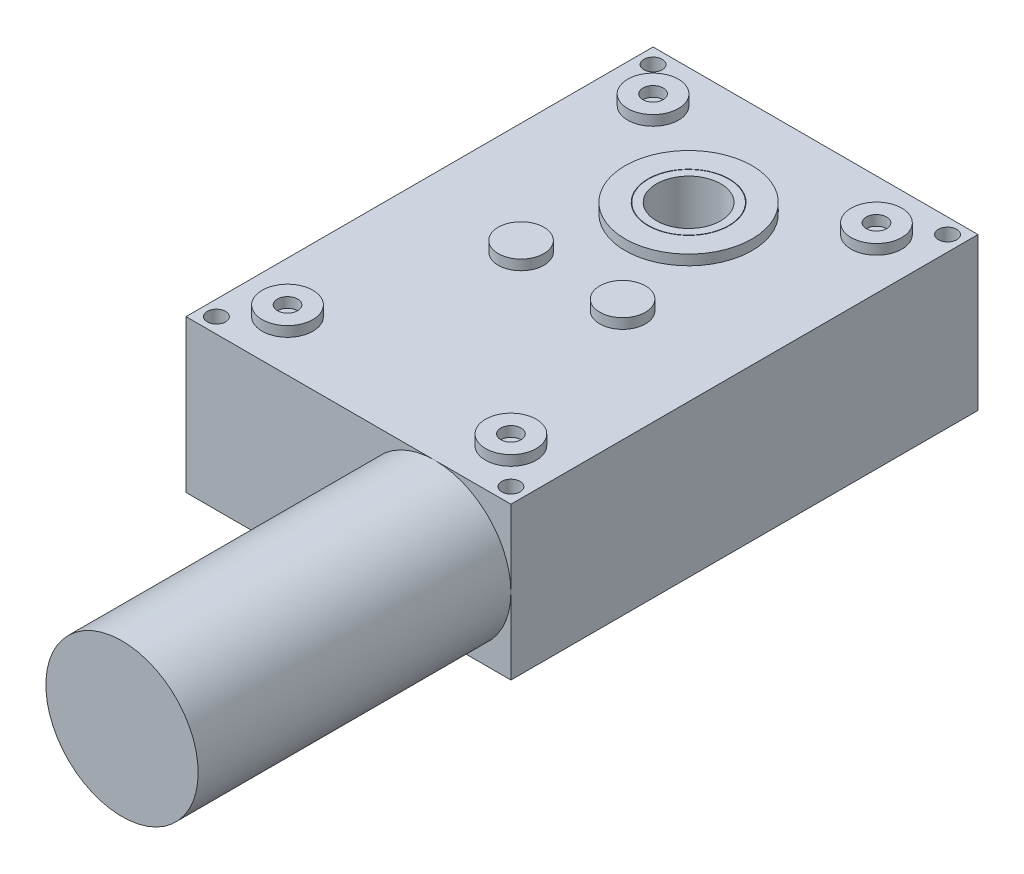
ISO-10303-21;
HEADER;
FILE_DESCRIPTION(('STEP AP214'),'2;1');
FILE_NAME('part.step','',(''),(''),'','','');
FILE_SCHEMA(('AUTOMOTIVE_DESIGN { 1 0 10303 214 1 1 1 1 }'));
ENDSEC;
DATA;
#1=APPLICATION_CONTEXT('core data for automotive mechanical design processes');
#2=APPLICATION_PROTOCOL_DEFINITION('international standard','automotive_design',2000,#1);
#3=PRODUCT_CONTEXT('',#1,'mechanical');
#4=PRODUCT('Part','Part','',(#3));
#5=PRODUCT_RELATED_PRODUCT_CATEGORY('part','',(#4));
#6=PRODUCT_DEFINITION_FORMATION('','',#4);
#7=PRODUCT_DEFINITION_CONTEXT('part definition',#1,'design');
#8=PRODUCT_DEFINITION('design','',#6,#7);
#9=PRODUCT_DEFINITION_SHAPE('','',#8);
#10=(LENGTH_UNIT() NAMED_UNIT(*) SI_UNIT(.MILLI.,.METRE.));
#11=(NAMED_UNIT(*) PLANE_ANGLE_UNIT() SI_UNIT($,.RADIAN.));
#12=(NAMED_UNIT(*) SI_UNIT($,.STERADIAN.) SOLID_ANGLE_UNIT());
#13=UNCERTAINTY_MEASURE_WITH_UNIT(LENGTH_MEASURE(1.E-05),#10,'distance_accuracy_value','');
#14=(GEOMETRIC_REPRESENTATION_CONTEXT(3) GLOBAL_UNCERTAINTY_ASSIGNED_CONTEXT((#13)) GLOBAL_UNIT_ASSIGNED_CONTEXT((#10,
#11,#12)) REPRESENTATION_CONTEXT('',''));
#15=CARTESIAN_POINT('',(0.,0.,0.));
#16=DIRECTION('',(0.,0.,1.));
#17=DIRECTION('',(1.,0.,0.));
#18=AXIS2_PLACEMENT_3D('',#15,#16,#17);
#19=CARTESIAN_POINT('',(-16.,15.,23.));
#20=DIRECTION('',(0.,0.,-1.));
#21=DIRECTION('',(-1.,0.,0.));
#22=AXIS2_PLACEMENT_3D('',#19,#20,#21);
#23=PLANE('',#22);
#24=CARTESIAN_POINT('',(8.5,7.5,23.));
#25=DIRECTION('',(0.,0.,1.));
#26=DIRECTION('',(1.,0.,0.));
#27=AXIS2_PLACEMENT_3D('',#24,#25,#26);
#28=CIRCLE('',#27,7.5);
#29=CARTESIAN_POINT('',(16.,7.5,23.));
#30=VERTEX_POINT('',#29);
#31=CARTESIAN_POINT('',(8.5,15.,23.));
#32=VERTEX_POINT('',#31);
#33=EDGE_CURVE('E198',#30,#32,#28,.T.);
#34=ORIENTED_EDGE('',*,*,#33,.F.);
#35=DIRECTION('',(0.,-1.,0.));
#36=VECTOR('',#35,1.);
#37=CARTESIAN_POINT('',(16.,15.,23.));
#38=LINE('',#37,#36);
#39=CARTESIAN_POINT('',(16.,15.,23.));
#40=VERTEX_POINT('',#39);
#41=EDGE_CURVE('E228',#40,#30,#38,.T.);
#42=ORIENTED_EDGE('',*,*,#41,.F.);
#43=DIRECTION('',(1.,0.,0.));
#44=VECTOR('',#43,1.);
#45=CARTESIAN_POINT('',(-16.,15.,23.));
#46=LINE('',#45,#44);
#47=EDGE_CURVE('E215',#32,#40,#46,.T.);
#48=ORIENTED_EDGE('',*,*,#47,.F.);
#49=EDGE_LOOP('',(#34,#42,#48));
#50=FACE_BOUND('',#49,.T.);
#51=ADVANCED_FACE('F40',(#50),#23,.F.);
#52=CARTESIAN_POINT('',(8.5,0.,23.));
#53=VERTEX_POINT('',#52);
#54=EDGE_CURVE('E55',#32,#53,#28,.T.);
#55=ORIENTED_EDGE('',*,*,#54,.F.);
#56=CARTESIAN_POINT('',(-16.,15.,23.));
#57=VERTEX_POINT('',#56);
#58=EDGE_CURVE('E216',#57,#32,#46,.T.);
#59=ORIENTED_EDGE('',*,*,#58,.F.);
#60=DIRECTION('',(0.,-1.,0.));
#61=VECTOR('',#60,1.);
#62=CARTESIAN_POINT('',(-16.,15.,23.));
#63=LINE('',#62,#61);
#64=CARTESIAN_POINT('',(-16.,0.,23.));
#65=VERTEX_POINT('',#64);
#66=EDGE_CURVE('E230',#57,#65,#63,.T.);
#67=ORIENTED_EDGE('',*,*,#66,.T.);
#68=DIRECTION('',(1.,0.,0.));
#69=VECTOR('',#68,1.);
#70=CARTESIAN_POINT('',(-16.,0.,23.));
#71=LINE('',#70,#69);
#72=EDGE_CURVE('E211',#65,#53,#71,.T.);
#73=ORIENTED_EDGE('',*,*,#72,.T.);
#74=EDGE_LOOP('',(#55,#59,#67,#73));
#75=FACE_BOUND('',#74,.T.);
#76=ADVANCED_FACE('F298',(#75),#23,.F.);
#77=CARTESIAN_POINT('',(16.,15.,23.));
#78=DIRECTION('',(-1.,0.,0.));
#79=DIRECTION('',(0.,0.,1.));
#80=AXIS2_PLACEMENT_3D('',#77,#78,#79);
#81=PLANE('',#80);
#82=DIRECTION('',(0.,0.,-1.));
#83=VECTOR('',#82,1.);
#84=CARTESIAN_POINT('',(16.,0.,23.));
#85=LINE('',#84,#83);
#86=CARTESIAN_POINT('',(16.,0.,23.));
#87=VERTEX_POINT('',#86);
#88=CARTESIAN_POINT('',(16.,0.,-23.));
#89=VERTEX_POINT('',#88);
#90=EDGE_CURVE('E204',#87,#89,#85,.T.);
#91=ORIENTED_EDGE('',*,*,#90,.T.);
#92=DIRECTION('',(0.,-1.,0.));
#93=VECTOR('',#92,1.);
#94=CARTESIAN_POINT('',(16.,15.,-23.));
#95=LINE('',#94,#93);
#96=CARTESIAN_POINT('',(16.,15.,-23.));
#97=VERTEX_POINT('',#96);
#98=EDGE_CURVE('E236',#97,#89,#95,.T.);
#99=ORIENTED_EDGE('',*,*,#98,.F.);
#100=DIRECTION('',(0.,0.,-1.));
#101=VECTOR('',#100,1.);
#102=CARTESIAN_POINT('',(16.,15.,23.));
#103=LINE('',#102,#101);
#104=EDGE_CURVE('E207',#40,#97,#103,.T.);
#105=ORIENTED_EDGE('',*,*,#104,.F.);
#106=ORIENTED_EDGE('',*,*,#41,.T.);
#107=EDGE_CURVE('E219',#30,#87,#38,.T.);
#108=ORIENTED_EDGE('',*,*,#107,.T.);
#109=EDGE_LOOP('',(#91,#99,#105,#106,#108));
#110=FACE_BOUND('',#109,.T.);
#111=ADVANCED_FACE('F42',(#110),#81,.F.);
#112=CARTESIAN_POINT('',(-16.,15.,-23.));
#113=DIRECTION('',(0.,0.,1.));
#114=DIRECTION('',(1.,0.,0.));
#115=AXIS2_PLACEMENT_3D('',#112,#113,#114);
#116=PLANE('',#115);
#117=DIRECTION('',(-1.,0.,0.));
#118=VECTOR('',#117,1.);
#119=CARTESIAN_POINT('',(-16.,0.,-23.));
#120=LINE('',#119,#118);
#121=CARTESIAN_POINT('',(-16.,0.,-23.));
#122=VERTEX_POINT('',#121);
#123=EDGE_CURVE('E222',#89,#122,#120,.T.);
#124=ORIENTED_EDGE('',*,*,#123,.T.);
#125=DIRECTION('',(0.,-1.,0.));
#126=VECTOR('',#125,1.);
#127=CARTESIAN_POINT('',(-16.,15.,-23.));
#128=LINE('',#127,#126);
#129=CARTESIAN_POINT('',(-16.,15.,-23.));
#130=VERTEX_POINT('',#129);
#131=EDGE_CURVE('E233',#130,#122,#128,.T.);
#132=ORIENTED_EDGE('',*,*,#131,.F.);
#133=DIRECTION('',(-1.,0.,0.));
#134=VECTOR('',#133,1.);
#135=CARTESIAN_POINT('',(-16.,15.,-23.));
#136=LINE('',#135,#134);
#137=EDGE_CURVE('E210',#97,#130,#136,.T.);
#138=ORIENTED_EDGE('',*,*,#137,.F.);
#139=ORIENTED_EDGE('',*,*,#98,.T.);
#140=EDGE_LOOP('',(#124,#132,#138,#139));
#141=FACE_BOUND('',#140,.T.);
#142=ADVANCED_FACE('F286',(#141),#116,.F.);
#143=CARTESIAN_POINT('',(-16.,15.,23.));
#144=DIRECTION('',(1.,0.,0.));
#145=DIRECTION('',(0.,0.,-1.));
#146=AXIS2_PLACEMENT_3D('',#143,#144,#145);
#147=PLANE('',#146);
#148=DIRECTION('',(0.,0.,1.));
#149=VECTOR('',#148,1.);
#150=CARTESIAN_POINT('',(-16.,0.,23.));
#151=LINE('',#150,#149);
#152=EDGE_CURVE('E224',#122,#65,#151,.T.);
#153=ORIENTED_EDGE('',*,*,#152,.T.);
#154=ORIENTED_EDGE('',*,*,#66,.F.);
#155=DIRECTION('',(0.,0.,1.));
#156=VECTOR('',#155,1.);
#157=CARTESIAN_POINT('',(-16.,15.,23.));
#158=LINE('',#157,#156);
#159=EDGE_CURVE('E213',#130,#57,#158,.T.);
#160=ORIENTED_EDGE('',*,*,#159,.F.);
#161=ORIENTED_EDGE('',*,*,#131,.T.);
#162=EDGE_LOOP('',(#153,#154,#160,#161));
#163=FACE_BOUND('',#162,.T.);
#164=ADVANCED_FACE('F291',(#163),#147,.F.);
#165=EDGE_CURVE('E63',#53,#30,#28,.T.);
#166=ORIENTED_EDGE('',*,*,#165,.F.);
#167=EDGE_CURVE('E226',#53,#87,#71,.T.);
#168=ORIENTED_EDGE('',*,*,#167,.T.);
#169=ORIENTED_EDGE('',*,*,#107,.F.);
#170=EDGE_LOOP('',(#166,#168,#169));
#171=FACE_BOUND('',#170,.T.);
#172=ADVANCED_FACE('F262',(#171),#23,.F.);
#173=CARTESIAN_POINT('',(0.,15.,0.));
#174=DIRECTION('',(0.,-1.,0.));
#175=DIRECTION('',(0.,0.,-1.));
#176=AXIS2_PLACEMENT_3D('',#173,#174,#175);
#177=PLANE('',#176);
#178=CARTESIAN_POINT('',(-14.5,15.,-21.5));
#179=DIRECTION('',(0.,1.,0.));
#180=DIRECTION('',(0.,0.,1.));
#181=AXIS2_PLACEMENT_3D('',#178,#179,#180);
#182=CIRCLE('',#181,0.899999999999989);
#183=CARTESIAN_POINT('',(-14.5,15.,-20.6));
#184=VERTEX_POINT('',#183);
#185=EDGE_CURVE('E115',#184,#184,#182,.T.);
#186=ORIENTED_EDGE('',*,*,#185,.F.);
#187=EDGE_LOOP('',(#186));
#188=FACE_BOUND('',#187,.T.);
#189=CARTESIAN_POINT('',(14.5,15.,-21.5));
#190=DIRECTION('',(0.,1.,0.));
#191=DIRECTION('',(0.,0.,1.));
#192=AXIS2_PLACEMENT_3D('',#189,#190,#191);
#193=CIRCLE('',#192,0.899999999999989);
#194=CARTESIAN_POINT('',(14.5,15.,-20.6));
#195=VERTEX_POINT('',#194);
#196=EDGE_CURVE('E114',#195,#195,#193,.T.);
#197=ORIENTED_EDGE('',*,*,#196,.F.);
#198=EDGE_LOOP('',(#197));
#199=FACE_BOUND('',#198,.T.);
#200=CARTESIAN_POINT('',(-14.5,15.,21.5));
#201=DIRECTION('',(0.,1.,0.));
#202=DIRECTION('',(0.,0.,1.));
#203=AXIS2_PLACEMENT_3D('',#200,#201,#202);
#204=CIRCLE('',#203,0.899999999999989);
#205=CARTESIAN_POINT('',(-14.5,15.,22.4));
#206=VERTEX_POINT('',#205);
#207=EDGE_CURVE('E125',#206,#206,#204,.T.);
#208=ORIENTED_EDGE('',*,*,#207,.F.);
#209=EDGE_LOOP('',(#208));
#210=FACE_BOUND('',#209,.T.);
#211=CARTESIAN_POINT('',(14.5,15.,21.5));
#212=DIRECTION('',(0.,1.,0.));
#213=DIRECTION('',(0.,0.,1.));
#214=AXIS2_PLACEMENT_3D('',#211,#212,#213);
#215=CIRCLE('',#214,0.899999999999989);
#216=CARTESIAN_POINT('',(14.5,15.,22.4));
#217=VERTEX_POINT('',#216);
#218=EDGE_CURVE('E131',#217,#217,#215,.T.);
#219=ORIENTED_EDGE('',*,*,#218,.F.);
#220=EDGE_LOOP('',(#219));
#221=FACE_BOUND('',#220,.T.);
#222=CARTESIAN_POINT('',(0.,15.,-10.5));
#223=DIRECTION('',(0.,-1.,0.));
#224=DIRECTION('',(0.,0.,-1.));
#225=AXIS2_PLACEMENT_3D('',#222,#223,#224);
#226=CIRCLE('',#225,6.25);
#227=CARTESIAN_POINT('',(0.,15.,-16.75));
#228=VERTEX_POINT('',#227);
#229=EDGE_CURVE('E48',#228,#228,#226,.F.);
#230=ORIENTED_EDGE('',*,*,#229,.F.);
#231=EDGE_LOOP('',(#230));
#232=FACE_BOUND('',#231,.T.);
#233=CARTESIAN_POINT('',(11.,15.,18.));
#234=DIRECTION('',(0.,-1.,0.));
#235=DIRECTION('',(0.,0.,-1.));
#236=AXIS2_PLACEMENT_3D('',#233,#234,#235);
#237=CIRCLE('',#236,2.5);
#238=CARTESIAN_POINT('',(11.,15.,15.5));
#239=VERTEX_POINT('',#238);
#240=EDGE_CURVE('E251',#239,#239,#237,.F.);
#241=ORIENTED_EDGE('',*,*,#240,.F.);
#242=EDGE_LOOP('',(#241));
#243=FACE_BOUND('',#242,.T.);
#244=CARTESIAN_POINT('',(-11.,15.,18.));
#245=DIRECTION('',(0.,1.,0.));
#246=DIRECTION('',(0.,0.,1.));
#247=AXIS2_PLACEMENT_3D('',#244,#245,#246);
#248=CIRCLE('',#247,2.5);
#249=CARTESIAN_POINT('',(-11.,15.,20.5));
#250=VERTEX_POINT('',#249);
#251=EDGE_CURVE('E162',#250,#250,#248,.F.);
#252=ORIENTED_EDGE('',*,*,#251,.T.);
#253=EDGE_LOOP('',(#252));
#254=FACE_BOUND('',#253,.T.);
#255=CARTESIAN_POINT('',(5.,15.,1.));
#256=DIRECTION('',(0.,1.,0.));
#257=DIRECTION('',(0.,0.,1.));
#258=AXIS2_PLACEMENT_3D('',#255,#256,#257);
#259=CIRCLE('',#258,2.25);
#260=CARTESIAN_POINT('',(5.,15.,3.25));
#261=VERTEX_POINT('',#260);
#262=EDGE_CURVE('E171',#261,#261,#259,.F.);
#263=ORIENTED_EDGE('',*,*,#262,.T.);
#264=EDGE_LOOP('',(#263));
#265=FACE_BOUND('',#264,.T.);
#266=CARTESIAN_POINT('',(-5.,15.,1.));
#267=DIRECTION('',(0.,-1.,0.));
#268=DIRECTION('',(0.,0.,-1.));
#269=AXIS2_PLACEMENT_3D('',#266,#267,#268);
#270=CIRCLE('',#269,2.25);
#271=CARTESIAN_POINT('',(-5.,15.,-1.25));
#272=VERTEX_POINT('',#271);
#273=EDGE_CURVE('E245',#272,#272,#270,.F.);
#274=ORIENTED_EDGE('',*,*,#273,.F.);
#275=EDGE_LOOP('',(#274));
#276=FACE_BOUND('',#275,.T.);
#277=CARTESIAN_POINT('',(11.,15.,-18.));
#278=DIRECTION('',(0.,1.,0.));
#279=DIRECTION('',(0.,0.,1.));
#280=AXIS2_PLACEMENT_3D('',#277,#278,#279);
#281=CIRCLE('',#280,2.5);
#282=CARTESIAN_POINT('',(11.,15.,-15.5));
#283=VERTEX_POINT('',#282);
#284=EDGE_CURVE('E182',#283,#283,#281,.F.);
#285=ORIENTED_EDGE('',*,*,#284,.T.);
#286=EDGE_LOOP('',(#285));
#287=FACE_BOUND('',#286,.T.);
#288=CARTESIAN_POINT('',(-11.,15.,-18.));
#289=DIRECTION('',(0.,-1.,0.));
#290=DIRECTION('',(0.,0.,-1.));
#291=AXIS2_PLACEMENT_3D('',#288,#289,#290);
#292=CIRCLE('',#291,2.5);
#293=CARTESIAN_POINT('',(-11.,15.,-20.5));
#294=VERTEX_POINT('',#293);
#295=EDGE_CURVE('E239',#294,#294,#292,.F.);
#296=ORIENTED_EDGE('',*,*,#295,.F.);
#297=EDGE_LOOP('',(#296));
#298=FACE_BOUND('',#297,.T.);
#299=ORIENTED_EDGE('',*,*,#104,.T.);
#300=ORIENTED_EDGE('',*,*,#137,.T.);
#301=ORIENTED_EDGE('',*,*,#159,.T.);
#302=ORIENTED_EDGE('',*,*,#58,.T.);
#303=ORIENTED_EDGE('',*,*,#47,.T.);
#304=EDGE_LOOP('',(#299,#300,#301,#302,#303));
#305=FACE_BOUND('',#304,.T.);
#306=ADVANCED_FACE('F258',(#188,#199,#210,#221,#232,#243,#254,#265,#276,#287,#298,#305),#177,.F.);
#307=CARTESIAN_POINT('',(0.,0.,0.));
#308=DIRECTION('',(0.,-1.,0.));
#309=DIRECTION('',(0.,0.,-1.));
#310=AXIS2_PLACEMENT_3D('',#307,#308,#309);
#311=PLANE('',#310);
#312=ORIENTED_EDGE('',*,*,#90,.F.);
#313=ORIENTED_EDGE('',*,*,#167,.F.);
#314=ORIENTED_EDGE('',*,*,#72,.F.);
#315=ORIENTED_EDGE('',*,*,#152,.F.);
#316=ORIENTED_EDGE('',*,*,#123,.F.);
#317=EDGE_LOOP('',(#312,#313,#314,#315,#316));
#318=FACE_BOUND('',#317,.T.);
#319=ADVANCED_FACE('F261',(#318),#311,.T.);
#320=CARTESIAN_POINT('',(8.5,7.5,53.8));
#321=DIRECTION('',(0.,0.,-1.));
#322=DIRECTION('',(-1.,0.,0.));
#323=AXIS2_PLACEMENT_3D('',#320,#321,#322);
#324=CYLINDRICAL_SURFACE('',#323,7.5);
#325=CARTESIAN_POINT('',(8.5,7.5,53.8));
#326=DIRECTION('',(0.,0.,1.));
#327=DIRECTION('',(1.,0.,0.));
#328=AXIS2_PLACEMENT_3D('',#325,#326,#327);
#329=CIRCLE('',#328,7.5);
#330=CARTESIAN_POINT('',(16.,7.5,53.8));
#331=VERTEX_POINT('',#330);
#332=EDGE_CURVE('E201',#331,#331,#329,.T.);
#333=ORIENTED_EDGE('',*,*,#332,.F.);
#334=EDGE_LOOP('',(#333));
#335=FACE_BOUND('',#334,.T.);
#336=ORIENTED_EDGE('',*,*,#33,.T.);
#337=ORIENTED_EDGE('',*,*,#54,.T.);
#338=ORIENTED_EDGE('',*,*,#165,.T.);
#339=EDGE_LOOP('',(#336,#337,#338));
#340=FACE_BOUND('',#339,.T.);
#341=ADVANCED_FACE('F294',(#335,#340),#324,.T.);
#342=CARTESIAN_POINT('',(8.5,7.5,53.8));
#343=DIRECTION('',(0.,0.,1.));
#344=DIRECTION('',(1.,0.,0.));
#345=AXIS2_PLACEMENT_3D('',#342,#343,#344);
#346=PLANE('',#345);
#347=ORIENTED_EDGE('',*,*,#332,.T.);
#348=EDGE_LOOP('',(#347));
#349=FACE_BOUND('',#348,.T.);
#350=ADVANCED_FACE('F345',(#349),#346,.T.);
#351=CARTESIAN_POINT('',(-11.,16.,-18.));
#352=DIRECTION('',(0.,-1.,0.));
#353=DIRECTION('',(0.,0.,-1.));
#354=AXIS2_PLACEMENT_3D('',#351,#352,#353);
#355=CYLINDRICAL_SURFACE('',#354,1.);
#356=CARTESIAN_POINT('',(-11.,16.,-18.));
#357=DIRECTION('',(0.,1.,0.));
#358=DIRECTION('',(0.,0.,1.));
#359=AXIS2_PLACEMENT_3D('',#356,#357,#358);
#360=CIRCLE('',#359,1.);
#361=CARTESIAN_POINT('',(-11.,16.,-17.));
#362=VERTEX_POINT('',#361);
#363=EDGE_CURVE('E192',#362,#362,#360,.T.);
#364=ORIENTED_EDGE('',*,*,#363,.T.);
#365=EDGE_LOOP('',(#364));
#366=FACE_BOUND('',#365,.T.);
#367=CARTESIAN_POINT('',(-11.,15.,-18.));
#368=DIRECTION('',(0.,1.,0.));
#369=DIRECTION('',(0.,0.,1.));
#370=AXIS2_PLACEMENT_3D('',#367,#368,#369);
#371=CIRCLE('',#370,1.);
#372=CARTESIAN_POINT('',(-11.,15.,-17.));
#373=VERTEX_POINT('',#372);
#374=EDGE_CURVE('E189',#373,#373,#371,.T.);
#375=ORIENTED_EDGE('',*,*,#374,.F.);
#376=EDGE_LOOP('',(#375));
#377=FACE_BOUND('',#376,.T.);
#378=ADVANCED_FACE('F356',(#366,#377),#355,.F.);
#379=CARTESIAN_POINT('',(-11.,16.,-18.));
#380=DIRECTION('',(0.,-1.,0.));
#381=DIRECTION('',(0.,0.,-1.));
#382=AXIS2_PLACEMENT_3D('',#379,#380,#381);
#383=CYLINDRICAL_SURFACE('',#382,2.5);
#384=CARTESIAN_POINT('',(-11.,16.,-18.));
#385=DIRECTION('',(0.,1.,0.));
#386=DIRECTION('',(0.,0.,1.));
#387=AXIS2_PLACEMENT_3D('',#384,#385,#386);
#388=CIRCLE('',#387,2.5);
#389=CARTESIAN_POINT('',(-11.,16.,-15.5));
#390=VERTEX_POINT('',#389);
#391=EDGE_CURVE('E195',#390,#390,#388,.T.);
#392=ORIENTED_EDGE('',*,*,#391,.F.);
#393=EDGE_LOOP('',(#392));
#394=FACE_BOUND('',#393,.T.);
#395=ORIENTED_EDGE('',*,*,#295,.T.);
#396=EDGE_LOOP('',(#395));
#397=FACE_BOUND('',#396,.T.);
#398=ADVANCED_FACE('F367',(#394,#397),#383,.T.);
#399=CARTESIAN_POINT('',(0.,16.,0.));
#400=DIRECTION('',(0.,1.,0.));
#401=DIRECTION('',(0.,0.,1.));
#402=AXIS2_PLACEMENT_3D('',#399,#400,#401);
#403=PLANE('',#402);
#404=ORIENTED_EDGE('',*,*,#363,.F.);
#405=EDGE_LOOP('',(#404));
#406=FACE_BOUND('',#405,.T.);
#407=ORIENTED_EDGE('',*,*,#391,.T.);
#408=EDGE_LOOP('',(#407));
#409=FACE_BOUND('',#408,.T.);
#410=ADVANCED_FACE('F378',(#406,#409),#403,.T.);
#411=ORIENTED_EDGE('',*,*,#374,.T.);
#412=EDGE_LOOP('',(#411));
#413=FACE_BOUND('',#412,.T.);
#414=ADVANCED_FACE('F266',(#413),#177,.F.);
#415=CARTESIAN_POINT('',(11.,16.,-18.));
#416=DIRECTION('',(0.,-1.,0.));
#417=DIRECTION('',(0.,0.,-1.));
#418=AXIS2_PLACEMENT_3D('',#415,#416,#417);
#419=CYLINDRICAL_SURFACE('',#418,2.5);
#420=CARTESIAN_POINT('',(11.,16.,-18.));
#421=DIRECTION('',(0.,1.,0.));
#422=DIRECTION('',(0.,0.,1.));
#423=AXIS2_PLACEMENT_3D('',#420,#421,#422);
#424=CIRCLE('',#423,2.5);
#425=CARTESIAN_POINT('',(11.,16.,-15.5));
#426=VERTEX_POINT('',#425);
#427=EDGE_CURVE('E183',#426,#426,#424,.F.);
#428=ORIENTED_EDGE('',*,*,#427,.T.);
#429=EDGE_LOOP('',(#428));
#430=FACE_BOUND('',#429,.T.);
#431=ORIENTED_EDGE('',*,*,#284,.F.);
#432=EDGE_LOOP('',(#431));
#433=FACE_BOUND('',#432,.T.);
#434=ADVANCED_FACE('F397',(#430,#433),#419,.T.);
#435=CARTESIAN_POINT('',(11.,16.,-18.));
#436=DIRECTION('',(0.,-1.,0.));
#437=DIRECTION('',(0.,0.,-1.));
#438=AXIS2_PLACEMENT_3D('',#435,#436,#437);
#439=CYLINDRICAL_SURFACE('',#438,1.);
#440=CARTESIAN_POINT('',(11.,16.,-18.));
#441=DIRECTION('',(0.,1.,0.));
#442=DIRECTION('',(0.,0.,1.));
#443=AXIS2_PLACEMENT_3D('',#440,#441,#442);
#444=CIRCLE('',#443,1.);
#445=CARTESIAN_POINT('',(11.,16.,-17.));
#446=VERTEX_POINT('',#445);
#447=EDGE_CURVE('E186',#446,#446,#444,.F.);
#448=ORIENTED_EDGE('',*,*,#447,.F.);
#449=EDGE_LOOP('',(#448));
#450=FACE_BOUND('',#449,.T.);
#451=CARTESIAN_POINT('',(11.,15.,-18.));
#452=DIRECTION('',(0.,-1.,0.));
#453=DIRECTION('',(0.,0.,-1.));
#454=AXIS2_PLACEMENT_3D('',#451,#452,#453);
#455=CIRCLE('',#454,1.);
#456=CARTESIAN_POINT('',(11.,15.,-19.));
#457=VERTEX_POINT('',#456);
#458=EDGE_CURVE('E242',#457,#457,#455,.T.);
#459=ORIENTED_EDGE('',*,*,#458,.T.);
#460=EDGE_LOOP('',(#459));
#461=FACE_BOUND('',#460,.T.);
#462=ADVANCED_FACE('F407',(#450,#461),#439,.F.);
#463=CARTESIAN_POINT('',(0.,16.,0.));
#464=DIRECTION('',(0.,1.,0.));
#465=DIRECTION('',(0.,0.,1.));
#466=AXIS2_PLACEMENT_3D('',#463,#464,#465);
#467=PLANE('',#466);
#468=ORIENTED_EDGE('',*,*,#427,.F.);
#469=EDGE_LOOP('',(#468));
#470=FACE_BOUND('',#469,.T.);
#471=ORIENTED_EDGE('',*,*,#447,.T.);
#472=EDGE_LOOP('',(#471));
#473=FACE_BOUND('',#472,.T.);
#474=ADVANCED_FACE('F417',(#470,#473),#467,.T.);
#475=ORIENTED_EDGE('',*,*,#458,.F.);
#476=EDGE_LOOP('',(#475));
#477=FACE_BOUND('',#476,.T.);
#478=ADVANCED_FACE('F399',(#477),#177,.F.);
#479=CARTESIAN_POINT('',(-5.,16.,1.));
#480=DIRECTION('',(0.,-1.,0.));
#481=DIRECTION('',(0.,0.,-1.));
#482=AXIS2_PLACEMENT_3D('',#479,#480,#481);
#483=CYLINDRICAL_SURFACE('',#482,2.25);
#484=CARTESIAN_POINT('',(-5.,16.,1.));
#485=DIRECTION('',(0.,1.,0.));
#486=DIRECTION('',(0.,0.,1.));
#487=AXIS2_PLACEMENT_3D('',#484,#485,#486);
#488=CIRCLE('',#487,2.25);
#489=CARTESIAN_POINT('',(-5.,16.,3.25));
#490=VERTEX_POINT('',#489);
#491=EDGE_CURVE('E177',#490,#490,#488,.T.);
#492=ORIENTED_EDGE('',*,*,#491,.F.);
#493=EDGE_LOOP('',(#492));
#494=FACE_BOUND('',#493,.T.);
#495=ORIENTED_EDGE('',*,*,#273,.T.);
#496=EDGE_LOOP('',(#495));
#497=FACE_BOUND('',#496,.T.);
#498=ADVANCED_FACE('F436',(#494,#497),#483,.T.);
#499=CARTESIAN_POINT('',(0.,16.,0.));
#500=DIRECTION('',(0.,1.,0.));
#501=DIRECTION('',(0.,0.,1.));
#502=AXIS2_PLACEMENT_3D('',#499,#500,#501);
#503=PLANE('',#502);
#504=ORIENTED_EDGE('',*,*,#491,.T.);
#505=EDGE_LOOP('',(#504));
#506=FACE_BOUND('',#505,.T.);
#507=ADVANCED_FACE('F446',(#506),#503,.T.);
#508=CARTESIAN_POINT('',(5.,16.,1.));
#509=DIRECTION('',(0.,-1.,0.));
#510=DIRECTION('',(0.,0.,-1.));
#511=AXIS2_PLACEMENT_3D('',#508,#509,#510);
#512=CYLINDRICAL_SURFACE('',#511,2.25);
#513=CARTESIAN_POINT('',(5.,16.,1.));
#514=DIRECTION('',(0.,1.,0.));
#515=DIRECTION('',(0.,0.,1.));
#516=AXIS2_PLACEMENT_3D('',#513,#514,#515);
#517=CIRCLE('',#516,2.25);
#518=CARTESIAN_POINT('',(5.,16.,3.25));
#519=VERTEX_POINT('',#518);
#520=EDGE_CURVE('E174',#519,#519,#517,.F.);
#521=ORIENTED_EDGE('',*,*,#520,.T.);
#522=EDGE_LOOP('',(#521));
#523=FACE_BOUND('',#522,.T.);
#524=ORIENTED_EDGE('',*,*,#262,.F.);
#525=EDGE_LOOP('',(#524));
#526=FACE_BOUND('',#525,.T.);
#527=ADVANCED_FACE('F456',(#523,#526),#512,.T.);
#528=CARTESIAN_POINT('',(0.,16.,0.));
#529=DIRECTION('',(0.,1.,0.));
#530=DIRECTION('',(0.,0.,1.));
#531=AXIS2_PLACEMENT_3D('',#528,#529,#530);
#532=PLANE('',#531);
#533=ORIENTED_EDGE('',*,*,#520,.F.);
#534=EDGE_LOOP('',(#533));
#535=FACE_BOUND('',#534,.T.);
#536=ADVANCED_FACE('F466',(#535),#532,.T.);
#537=CARTESIAN_POINT('',(-11.,16.,18.));
#538=DIRECTION('',(0.,-1.,0.));
#539=DIRECTION('',(0.,0.,-1.));
#540=AXIS2_PLACEMENT_3D('',#537,#538,#539);
#541=CYLINDRICAL_SURFACE('',#540,2.5);
#542=CARTESIAN_POINT('',(-11.,16.,18.));
#543=DIRECTION('',(0.,1.,0.));
#544=DIRECTION('',(0.,0.,1.));
#545=AXIS2_PLACEMENT_3D('',#542,#543,#544);
#546=CIRCLE('',#545,2.5);
#547=CARTESIAN_POINT('',(-11.,16.,20.5));
#548=VERTEX_POINT('',#547);
#549=EDGE_CURVE('E165',#548,#548,#546,.F.);
#550=ORIENTED_EDGE('',*,*,#549,.T.);
#551=EDGE_LOOP('',(#550));
#552=FACE_BOUND('',#551,.T.);
#553=ORIENTED_EDGE('',*,*,#251,.F.);
#554=EDGE_LOOP('',(#553));
#555=FACE_BOUND('',#554,.T.);
#556=ADVANCED_FACE('F476',(#552,#555),#541,.T.);
#557=CARTESIAN_POINT('',(-11.,16.,18.));
#558=DIRECTION('',(0.,-1.,0.));
#559=DIRECTION('',(0.,0.,-1.));
#560=AXIS2_PLACEMENT_3D('',#557,#558,#559);
#561=CYLINDRICAL_SURFACE('',#560,1.);
#562=CARTESIAN_POINT('',(-11.,16.,18.));
#563=DIRECTION('',(0.,1.,0.));
#564=DIRECTION('',(0.,0.,1.));
#565=AXIS2_PLACEMENT_3D('',#562,#563,#564);
#566=CIRCLE('',#565,1.);
#567=CARTESIAN_POINT('',(-11.,16.,19.));
#568=VERTEX_POINT('',#567);
#569=EDGE_CURVE('E168',#568,#568,#566,.F.);
#570=ORIENTED_EDGE('',*,*,#569,.F.);
#571=EDGE_LOOP('',(#570));
#572=FACE_BOUND('',#571,.T.);
#573=CARTESIAN_POINT('',(-11.,15.,18.));
#574=DIRECTION('',(0.,-1.,0.));
#575=DIRECTION('',(0.,0.,-1.));
#576=AXIS2_PLACEMENT_3D('',#573,#574,#575);
#577=CIRCLE('',#576,1.);
#578=CARTESIAN_POINT('',(-11.,15.,17.));
#579=VERTEX_POINT('',#578);
#580=EDGE_CURVE('E248',#579,#579,#577,.T.);
#581=ORIENTED_EDGE('',*,*,#580,.T.);
#582=EDGE_LOOP('',(#581));
#583=FACE_BOUND('',#582,.T.);
#584=ADVANCED_FACE('F486',(#572,#583),#561,.F.);
#585=CARTESIAN_POINT('',(0.,16.,0.));
#586=DIRECTION('',(0.,1.,0.));
#587=DIRECTION('',(0.,0.,1.));
#588=AXIS2_PLACEMENT_3D('',#585,#586,#587);
#589=PLANE('',#588);
#590=ORIENTED_EDGE('',*,*,#549,.F.);
#591=EDGE_LOOP('',(#590));
#592=FACE_BOUND('',#591,.T.);
#593=ORIENTED_EDGE('',*,*,#569,.T.);
#594=EDGE_LOOP('',(#593));
#595=FACE_BOUND('',#594,.T.);
#596=ADVANCED_FACE('F496',(#592,#595),#589,.T.);
#597=ORIENTED_EDGE('',*,*,#580,.F.);
#598=EDGE_LOOP('',(#597));
#599=FACE_BOUND('',#598,.T.);
#600=ADVANCED_FACE('F438',(#599),#177,.F.);
#601=CARTESIAN_POINT('',(11.,16.,18.));
#602=DIRECTION('',(0.,-1.,0.));
#603=DIRECTION('',(0.,0.,-1.));
#604=AXIS2_PLACEMENT_3D('',#601,#602,#603);
#605=CYLINDRICAL_SURFACE('',#604,1.);
#606=CARTESIAN_POINT('',(11.,16.,18.));
#607=DIRECTION('',(0.,1.,0.));
#608=DIRECTION('',(0.,0.,1.));
#609=AXIS2_PLACEMENT_3D('',#606,#607,#608);
#610=CIRCLE('',#609,1.);
#611=CARTESIAN_POINT('',(11.,16.,19.));
#612=VERTEX_POINT('',#611);
#613=EDGE_CURVE('E156',#612,#612,#610,.T.);
#614=ORIENTED_EDGE('',*,*,#613,.T.);
#615=EDGE_LOOP('',(#614));
#616=FACE_BOUND('',#615,.T.);
#617=CARTESIAN_POINT('',(11.,15.,18.));
#618=DIRECTION('',(0.,1.,0.));
#619=DIRECTION('',(0.,0.,1.));
#620=AXIS2_PLACEMENT_3D('',#617,#618,#619);
#621=CIRCLE('',#620,1.);
#622=CARTESIAN_POINT('',(11.,15.,19.));
#623=VERTEX_POINT('',#622);
#624=EDGE_CURVE('E153',#623,#623,#621,.T.);
#625=ORIENTED_EDGE('',*,*,#624,.F.);
#626=EDGE_LOOP('',(#625));
#627=FACE_BOUND('',#626,.T.);
#628=ADVANCED_FACE('F515',(#616,#627),#605,.F.);
#629=CARTESIAN_POINT('',(11.,16.,18.));
#630=DIRECTION('',(0.,-1.,0.));
#631=DIRECTION('',(0.,0.,-1.));
#632=AXIS2_PLACEMENT_3D('',#629,#630,#631);
#633=CYLINDRICAL_SURFACE('',#632,2.5);
#634=CARTESIAN_POINT('',(11.,16.,18.));
#635=DIRECTION('',(0.,1.,0.));
#636=DIRECTION('',(0.,0.,1.));
#637=AXIS2_PLACEMENT_3D('',#634,#635,#636);
#638=CIRCLE('',#637,2.5);
#639=CARTESIAN_POINT('',(11.,16.,20.5));
#640=VERTEX_POINT('',#639);
#641=EDGE_CURVE('E159',#640,#640,#638,.T.);
#642=ORIENTED_EDGE('',*,*,#641,.F.);
#643=EDGE_LOOP('',(#642));
#644=FACE_BOUND('',#643,.T.);
#645=ORIENTED_EDGE('',*,*,#240,.T.);
#646=EDGE_LOOP('',(#645));
#647=FACE_BOUND('',#646,.T.);
#648=ADVANCED_FACE('F525',(#644,#647),#633,.T.);
#649=CARTESIAN_POINT('',(0.,16.,0.));
#650=DIRECTION('',(0.,1.,0.));
#651=DIRECTION('',(0.,0.,1.));
#652=AXIS2_PLACEMENT_3D('',#649,#650,#651);
#653=PLANE('',#652);
#654=ORIENTED_EDGE('',*,*,#613,.F.);
#655=EDGE_LOOP('',(#654));
#656=FACE_BOUND('',#655,.T.);
#657=ORIENTED_EDGE('',*,*,#641,.T.);
#658=EDGE_LOOP('',(#657));
#659=FACE_BOUND('',#658,.T.);
#660=ADVANCED_FACE('F535',(#656,#659),#653,.T.);
#661=ORIENTED_EDGE('',*,*,#624,.T.);
#662=EDGE_LOOP('',(#661));
#663=FACE_BOUND('',#662,.T.);
#664=ADVANCED_FACE('F517',(#663),#177,.F.);
#665=CARTESIAN_POINT('',(0.,16.,-10.5));
#666=DIRECTION('',(0.,-1.,0.));
#667=DIRECTION('',(0.,0.,-1.));
#668=AXIS2_PLACEMENT_3D('',#665,#666,#667);
#669=CYLINDRICAL_SURFACE('',#668,4.);
#670=CARTESIAN_POINT('',(0.,16.,-10.5));
#671=DIRECTION('',(0.,1.,0.));
#672=DIRECTION('',(0.,0.,1.));
#673=AXIS2_PLACEMENT_3D('',#670,#671,#672);
#674=CIRCLE('',#673,4.);
#675=CARTESIAN_POINT('',(0.,16.,-6.5));
#676=VERTEX_POINT('',#675);
#677=EDGE_CURVE('E147',#676,#676,#674,.T.);
#678=ORIENTED_EDGE('',*,*,#677,.T.);
#679=EDGE_LOOP('',(#678));
#680=FACE_BOUND('',#679,.T.);
#681=CARTESIAN_POINT('',(0.,15.,-10.5));
#682=DIRECTION('',(0.,1.,0.));
#683=DIRECTION('',(0.,0.,1.));
#684=AXIS2_PLACEMENT_3D('',#681,#682,#683);
#685=CIRCLE('',#684,4.);
#686=CARTESIAN_POINT('',(0.,15.,-6.5));
#687=VERTEX_POINT('',#686);
#688=EDGE_CURVE('E146',#687,#687,#685,.T.);
#689=ORIENTED_EDGE('',*,*,#688,.F.);
#690=EDGE_LOOP('',(#689));
#691=FACE_BOUND('',#690,.T.);
#692=ADVANCED_FACE('F554',(#680,#691),#669,.F.);
#693=CARTESIAN_POINT('',(0.,16.,-10.5));
#694=DIRECTION('',(0.,-1.,0.));
#695=DIRECTION('',(0.,0.,-1.));
#696=AXIS2_PLACEMENT_3D('',#693,#694,#695);
#697=CYLINDRICAL_SURFACE('',#696,6.25);
#698=CARTESIAN_POINT('',(0.,16.,-10.5));
#699=DIRECTION('',(0.,1.,0.));
#700=DIRECTION('',(0.,0.,1.));
#701=AXIS2_PLACEMENT_3D('',#698,#699,#700);
#702=CIRCLE('',#701,6.25);
#703=CARTESIAN_POINT('',(0.,16.,-4.25));
#704=VERTEX_POINT('',#703);
#705=EDGE_CURVE('E150',#704,#704,#702,.T.);
#706=ORIENTED_EDGE('',*,*,#705,.F.);
#707=EDGE_LOOP('',(#706));
#708=FACE_BOUND('',#707,.T.);
#709=ORIENTED_EDGE('',*,*,#229,.T.);
#710=EDGE_LOOP('',(#709));
#711=FACE_BOUND('',#710,.T.);
#712=ADVANCED_FACE('F256',(#708,#711),#697,.T.);
#713=CARTESIAN_POINT('',(0.,16.,0.));
#714=DIRECTION('',(0.,1.,0.));
#715=DIRECTION('',(0.,0.,1.));
#716=AXIS2_PLACEMENT_3D('',#713,#714,#715);
#717=PLANE('',#716);
#718=ORIENTED_EDGE('',*,*,#677,.F.);
#719=EDGE_LOOP('',(#718));
#720=FACE_BOUND('',#719,.T.);
#721=ORIENTED_EDGE('',*,*,#705,.T.);
#722=EDGE_LOOP('',(#721));
#723=FACE_BOUND('',#722,.T.);
#724=ADVANCED_FACE('F571',(#720,#723),#717,.T.);
#725=CARTESIAN_POINT('',(0.,15.,-10.5));
#726=DIRECTION('',(0.,-1.,0.));
#727=DIRECTION('',(0.,0.,-1.));
#728=AXIS2_PLACEMENT_3D('',#725,#726,#727);
#729=CIRCLE('',#728,3.95870940136841);
#730=CARTESIAN_POINT('',(0.,15.,-14.4587094013684));
#731=VERTEX_POINT('',#730);
#732=EDGE_CURVE('E12',#731,#731,#729,.F.);
#733=ORIENTED_EDGE('',*,*,#732,.F.);
#734=EDGE_LOOP('',(#733));
#735=FACE_BOUND('',#734,.T.);
#736=ORIENTED_EDGE('',*,*,#688,.T.);
#737=EDGE_LOOP('',(#736));
#738=FACE_BOUND('',#737,.T.);
#739=ADVANCED_FACE('F265',(#735,#738),#177,.F.);
#740=CARTESIAN_POINT('',(0.,16.,-10.5));
#741=DIRECTION('',(0.,-1.,0.));
#742=DIRECTION('',(0.,0.,-1.));
#743=AXIS2_PLACEMENT_3D('',#740,#741,#742);
#744=CYLINDRICAL_SURFACE('',#743,3.16380882402023);
#745=CARTESIAN_POINT('',(0.,16.,-10.5));
#746=DIRECTION('',(0.,1.,0.));
#747=DIRECTION('',(0.,0.,1.));
#748=AXIS2_PLACEMENT_3D('',#745,#746,#747);
#749=CIRCLE('',#748,3.16380882402023);
#750=CARTESIAN_POINT('',(0.,16.,-7.33619117597976));
#751=VERTEX_POINT('',#750);
#752=EDGE_CURVE('E140',#751,#751,#749,.T.);
#753=ORIENTED_EDGE('',*,*,#752,.T.);
#754=EDGE_LOOP('',(#753));
#755=FACE_BOUND('',#754,.T.);
#756=CARTESIAN_POINT('',(0.,5.,-10.5));
#757=DIRECTION('',(0.,1.,0.));
#758=DIRECTION('',(0.,0.,1.));
#759=AXIS2_PLACEMENT_3D('',#756,#757,#758);
#760=CIRCLE('',#759,3.16380882402023);
#761=CARTESIAN_POINT('',(0.,5.,-7.33619117597976));
#762=VERTEX_POINT('',#761);
#763=EDGE_CURVE('E137',#762,#762,#760,.T.);
#764=ORIENTED_EDGE('',*,*,#763,.F.);
#765=EDGE_LOOP('',(#764));
#766=FACE_BOUND('',#765,.T.);
#767=ADVANCED_FACE('F590',(#755,#766),#744,.F.);
#768=CARTESIAN_POINT('',(0.,16.,-10.5));
#769=DIRECTION('',(0.,-1.,0.));
#770=DIRECTION('',(0.,0.,-1.));
#771=AXIS2_PLACEMENT_3D('',#768,#769,#770);
#772=CYLINDRICAL_SURFACE('',#771,3.95870940136841);
#773=CARTESIAN_POINT('',(0.,16.,-10.5));
#774=DIRECTION('',(0.,1.,0.));
#775=DIRECTION('',(0.,0.,1.));
#776=AXIS2_PLACEMENT_3D('',#773,#774,#775);
#777=CIRCLE('',#776,3.95870940136841);
#778=CARTESIAN_POINT('',(0.,16.,-6.54129059863159));
#779=VERTEX_POINT('',#778);
#780=EDGE_CURVE('E143',#779,#779,#777,.T.);
#781=ORIENTED_EDGE('',*,*,#780,.F.);
#782=EDGE_LOOP('',(#781));
#783=FACE_BOUND('',#782,.T.);
#784=ORIENTED_EDGE('',*,*,#732,.T.);
#785=EDGE_LOOP('',(#784));
#786=FACE_BOUND('',#785,.T.);
#787=ADVANCED_FACE('F596',(#783,#786),#772,.T.);
#788=CARTESIAN_POINT('',(0.,16.,0.));
#789=DIRECTION('',(0.,1.,0.));
#790=DIRECTION('',(0.,0.,1.));
#791=AXIS2_PLACEMENT_3D('',#788,#789,#790);
#792=PLANE('',#791);
#793=ORIENTED_EDGE('',*,*,#752,.F.);
#794=EDGE_LOOP('',(#793));
#795=FACE_BOUND('',#794,.T.);
#796=ORIENTED_EDGE('',*,*,#780,.T.);
#797=EDGE_LOOP('',(#796));
#798=FACE_BOUND('',#797,.T.);
#799=ADVANCED_FACE('F601',(#795,#798),#792,.T.);
#800=CARTESIAN_POINT('',(0.,5.,0.));
#801=DIRECTION('',(0.,1.,0.));
#802=DIRECTION('',(0.,0.,1.));
#803=AXIS2_PLACEMENT_3D('',#800,#801,#802);
#804=PLANE('',#803);
#805=ORIENTED_EDGE('',*,*,#763,.T.);
#806=EDGE_LOOP('',(#805));
#807=FACE_BOUND('',#806,.T.);
#808=ADVANCED_FACE('F611',(#807),#804,.T.);
#809=CARTESIAN_POINT('',(14.5,12.,21.5));
#810=DIRECTION('',(0.,1.,0.));
#811=DIRECTION('',(0.,0.,1.));
#812=AXIS2_PLACEMENT_3D('',#809,#810,#811);
#813=CONICAL_SURFACE('',#812,0.9,1.02974425867665);
#814=CARTESIAN_POINT('',(14.5,11.4592254428752,21.5));
#815=VERTEX_POINT('',#814);
#816=VERTEX_LOOP('',#815);
#817=FACE_BOUND('',#816,.T.);
#818=CARTESIAN_POINT('',(14.5,12.,21.5));
#819=DIRECTION('',(0.,1.,0.));
#820=DIRECTION('',(0.,0.,1.));
#821=AXIS2_PLACEMENT_3D('',#818,#819,#820);
#822=CIRCLE('',#821,0.9);
#823=CARTESIAN_POINT('',(14.5,12.,22.4));
#824=VERTEX_POINT('',#823);
#825=EDGE_CURVE('E134',#824,#824,#822,.T.);
#826=ORIENTED_EDGE('',*,*,#825,.T.);
#827=EDGE_LOOP('',(#826));
#828=FACE_BOUND('',#827,.T.);
#829=ADVANCED_FACE('F629',(#817,#828),#813,.F.);
#830=CARTESIAN_POINT('',(14.5,15.,21.5));
#831=DIRECTION('',(0.,1.,0.));
#832=DIRECTION('',(0.,0.,1.));
#833=AXIS2_PLACEMENT_3D('',#830,#831,#832);
#834=CYLINDRICAL_SURFACE('',#833,0.899999999999995);
#835=ORIENTED_EDGE('',*,*,#825,.F.);
#836=EDGE_LOOP('',(#835));
#837=FACE_BOUND('',#836,.T.);
#838=ORIENTED_EDGE('',*,*,#218,.T.);
#839=EDGE_LOOP('',(#838));
#840=FACE_BOUND('',#839,.T.);
#841=ADVANCED_FACE('F644',(#837,#840),#834,.F.);
#842=CARTESIAN_POINT('',(-14.5,12.,21.5));
#843=DIRECTION('',(0.,1.,0.));
#844=DIRECTION('',(0.,0.,1.));
#845=AXIS2_PLACEMENT_3D('',#842,#843,#844);
#846=CONICAL_SURFACE('',#845,0.9,1.02974425867665);
#847=CARTESIAN_POINT('',(-14.5,11.4592254428752,21.5));
#848=VERTEX_POINT('',#847);
#849=VERTEX_LOOP('',#848);
#850=FACE_BOUND('',#849,.T.);
#851=CARTESIAN_POINT('',(-14.5,12.,21.5));
#852=DIRECTION('',(0.,1.,0.));
#853=DIRECTION('',(0.,0.,1.));
#854=AXIS2_PLACEMENT_3D('',#851,#852,#853);
#855=CIRCLE('',#854,0.9);
#856=CARTESIAN_POINT('',(-14.5,12.,22.4));
#857=VERTEX_POINT('',#856);
#858=EDGE_CURVE('E128',#857,#857,#855,.T.);
#859=ORIENTED_EDGE('',*,*,#858,.T.);
#860=EDGE_LOOP('',(#859));
#861=FACE_BOUND('',#860,.T.);
#862=ADVANCED_FACE('F654',(#850,#861),#846,.F.);
#863=CARTESIAN_POINT('',(-14.5,15.,21.5));
#864=DIRECTION('',(0.,1.,0.));
#865=DIRECTION('',(0.,0.,1.));
#866=AXIS2_PLACEMENT_3D('',#863,#864,#865);
#867=CYLINDRICAL_SURFACE('',#866,0.899999999999995);
#868=ORIENTED_EDGE('',*,*,#858,.F.);
#869=EDGE_LOOP('',(#868));
#870=FACE_BOUND('',#869,.T.);
#871=ORIENTED_EDGE('',*,*,#207,.T.);
#872=EDGE_LOOP('',(#871));
#873=FACE_BOUND('',#872,.T.);
#874=ADVANCED_FACE('F664',(#870,#873),#867,.F.);
#875=CARTESIAN_POINT('',(14.5,12.,-21.5));
#876=DIRECTION('',(0.,1.,0.));
#877=DIRECTION('',(0.,0.,1.));
#878=AXIS2_PLACEMENT_3D('',#875,#876,#877);
#879=CONICAL_SURFACE('',#878,0.9,1.02974425867665);
#880=CARTESIAN_POINT('',(14.5,11.4592254428752,-21.5));
#881=VERTEX_POINT('',#880);
#882=VERTEX_LOOP('',#881);
#883=FACE_BOUND('',#882,.T.);
#884=CARTESIAN_POINT('',(14.5,12.,-21.5));
#885=DIRECTION('',(0.,1.,0.));
#886=DIRECTION('',(0.,0.,1.));
#887=AXIS2_PLACEMENT_3D('',#884,#885,#886);
#888=CIRCLE('',#887,0.9);
#889=CARTESIAN_POINT('',(14.5,12.,-20.6));
#890=VERTEX_POINT('',#889);
#891=EDGE_CURVE('E118',#890,#890,#888,.T.);
#892=ORIENTED_EDGE('',*,*,#891,.T.);
#893=EDGE_LOOP('',(#892));
#894=FACE_BOUND('',#893,.T.);
#895=ADVANCED_FACE('F674',(#883,#894),#879,.F.);
#896=CARTESIAN_POINT('',(14.5,15.,-21.5));
#897=DIRECTION('',(0.,1.,0.));
#898=DIRECTION('',(0.,0.,1.));
#899=AXIS2_PLACEMENT_3D('',#896,#897,#898);
#900=CYLINDRICAL_SURFACE('',#899,0.899999999999995);
#901=ORIENTED_EDGE('',*,*,#891,.F.);
#902=EDGE_LOOP('',(#901));
#903=FACE_BOUND('',#902,.T.);
#904=ORIENTED_EDGE('',*,*,#196,.T.);
#905=EDGE_LOOP('',(#904));
#906=FACE_BOUND('',#905,.T.);
#907=ADVANCED_FACE('F108',(#903,#906),#900,.F.);
#908=CARTESIAN_POINT('',(-14.5,12.,-21.5));
#909=DIRECTION('',(0.,1.,0.));
#910=DIRECTION('',(0.,0.,1.));
#911=AXIS2_PLACEMENT_3D('',#908,#909,#910);
#912=CONICAL_SURFACE('',#911,0.9,1.02974425867665);
#913=CARTESIAN_POINT('',(-14.5,11.4592254428752,-21.5));
#914=VERTEX_POINT('',#913);
#915=VERTEX_LOOP('',#914);
#916=FACE_BOUND('',#915,.T.);
#917=CARTESIAN_POINT('',(-14.5,12.,-21.5));
#918=DIRECTION('',(0.,1.,0.));
#919=DIRECTION('',(0.,0.,1.));
#920=AXIS2_PLACEMENT_3D('',#917,#918,#919);
#921=CIRCLE('',#920,0.9);
#922=CARTESIAN_POINT('',(-14.5,12.,-20.6));
#923=VERTEX_POINT('',#922);
#924=EDGE_CURVE('E112',#923,#923,#921,.T.);
#925=ORIENTED_EDGE('',*,*,#924,.T.);
#926=EDGE_LOOP('',(#925));
#927=FACE_BOUND('',#926,.T.);
#928=ADVANCED_FACE('F104',(#916,#927),#912,.F.);
#929=CARTESIAN_POINT('',(-14.5,15.,-21.5));
#930=DIRECTION('',(0.,1.,0.));
#931=DIRECTION('',(0.,0.,1.));
#932=AXIS2_PLACEMENT_3D('',#929,#930,#931);
#933=CYLINDRICAL_SURFACE('',#932,0.899999999999995);
#934=ORIENTED_EDGE('',*,*,#924,.F.);
#935=EDGE_LOOP('',(#934));
#936=FACE_BOUND('',#935,.T.);
#937=ORIENTED_EDGE('',*,*,#185,.T.);
#938=EDGE_LOOP('',(#937));
#939=FACE_BOUND('',#938,.T.);
#940=ADVANCED_FACE('F107',(#936,#939),#933,.F.);
#941=CLOSED_SHELL('',(#51,#76,#111,#142,#164,#172,#306,#319,#341,#350,#378,#398,#410,#414,#434,
#462,#474,#478,#498,#507,#527,#536,#556,#584,#596,#600,#628,#648,#660,#664,#692,#712,#724,#739,
#767,#787,#799,#808,#829,#841,#862,#874,#895,#907,#928,#940));
#942=MANIFOLD_SOLID_BREP('B2',#941);
#943=ADVANCED_BREP_SHAPE_REPRESENTATION('',(#18,#942),#14);
#944=SHAPE_DEFINITION_REPRESENTATION(#9,#943);
ENDSEC;
END-ISO-10303-21;
